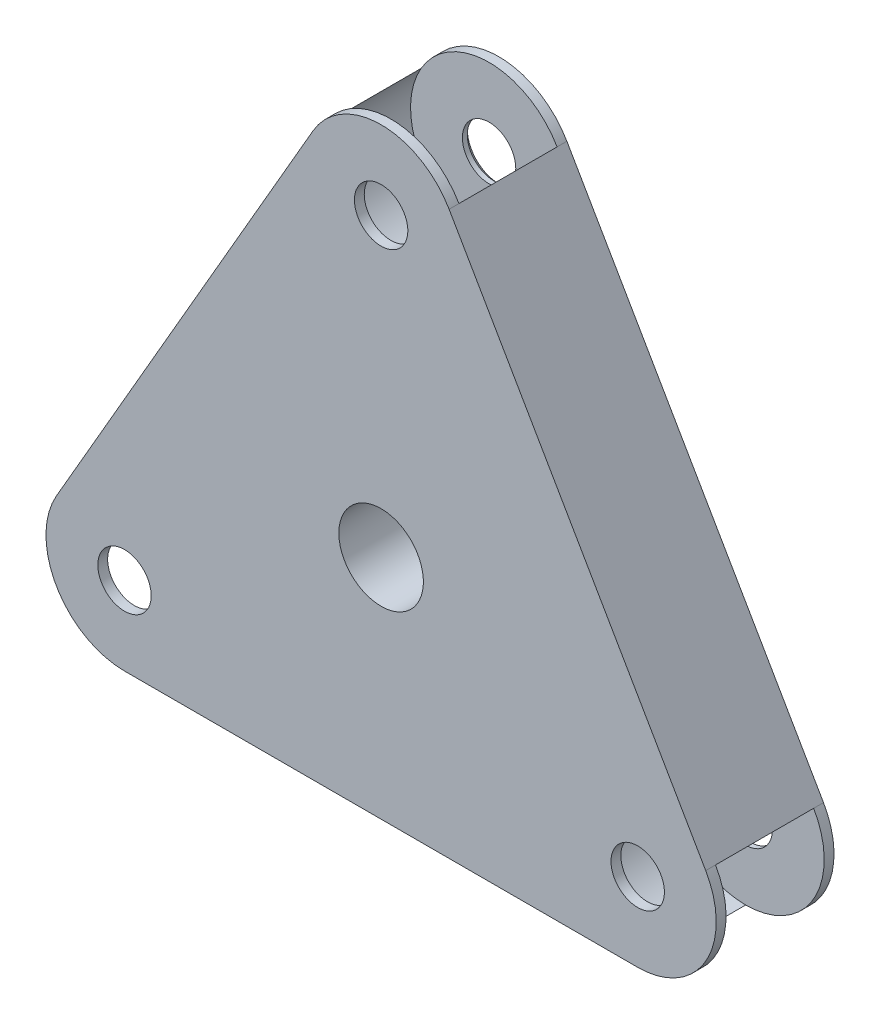
ISO-10303-21;
HEADER;
FILE_DESCRIPTION(('STEP AP214'),'2;1');
FILE_NAME('part.step','',(''),(''),'','','');
FILE_SCHEMA(('AUTOMOTIVE_DESIGN { 1 0 10303 214 1 1 1 1 }'));
ENDSEC;
DATA;
#1=APPLICATION_CONTEXT('core data for automotive mechanical design processes');
#2=APPLICATION_PROTOCOL_DEFINITION('international standard','automotive_design',2000,#1);
#3=PRODUCT_CONTEXT('',#1,'mechanical');
#4=PRODUCT('Part','Part','',(#3));
#5=PRODUCT_RELATED_PRODUCT_CATEGORY('part','',(#4));
#6=PRODUCT_DEFINITION_FORMATION('','',#4);
#7=PRODUCT_DEFINITION_CONTEXT('part definition',#1,'design');
#8=PRODUCT_DEFINITION('design','',#6,#7);
#9=PRODUCT_DEFINITION_SHAPE('','',#8);
#10=(LENGTH_UNIT() NAMED_UNIT(*) SI_UNIT(.MILLI.,.METRE.));
#11=(NAMED_UNIT(*) PLANE_ANGLE_UNIT() SI_UNIT($,.RADIAN.));
#12=(NAMED_UNIT(*) SI_UNIT($,.STERADIAN.) SOLID_ANGLE_UNIT());
#13=UNCERTAINTY_MEASURE_WITH_UNIT(LENGTH_MEASURE(1.E-05),#10,'distance_accuracy_value','');
#14=(GEOMETRIC_REPRESENTATION_CONTEXT(3) GLOBAL_UNCERTAINTY_ASSIGNED_CONTEXT((#13)) GLOBAL_UNIT_ASSIGNED_CONTEXT((#10,
#11,#12)) REPRESENTATION_CONTEXT('',''));
#15=CARTESIAN_POINT('',(0.,0.,0.));
#16=DIRECTION('',(0.,0.,1.));
#17=DIRECTION('',(1.,0.,0.));
#18=AXIS2_PLACEMENT_3D('',#15,#16,#17);
#19=CARTESIAN_POINT('',(32.6794919243113,-18.8675134594813,15.));
#20=DIRECTION('',(0.,0.,-1.));
#21=DIRECTION('',(-1.,0.,0.));
#22=AXIS2_PLACEMENT_3D('',#19,#20,#21);
#23=CYLINDRICAL_SURFACE('',#22,10.);
#24=CARTESIAN_POINT('',(32.6794919243112,-18.8675134594815,1.25));
#25=DIRECTION('',(0.,0.,1.));
#26=DIRECTION('',(-0.500000000000004,-0.866025403784436,0.));
#27=AXIS2_PLACEMENT_3D('',#24,#25,#26);
#28=CIRCLE('',#27,10.);
#29=CARTESIAN_POINT('',(32.6794919243112,-28.8675134594813,1.25));
#30=VERTEX_POINT('',#29);
#31=CARTESIAN_POINT('',(41.3397459621557,-13.8675134594814,1.25));
#32=VERTEX_POINT('',#31);
#33=EDGE_CURVE('E175',#30,#32,#28,.T.);
#34=ORIENTED_EDGE('',*,*,#33,.F.);
#35=DIRECTION('',(0.,0.,-1.));
#36=VECTOR('',#35,1.);
#37=CARTESIAN_POINT('',(32.6794919243113,-28.8675134594813,15.));
#38=LINE('',#37,#36);
#39=CARTESIAN_POINT('',(32.6794919243113,-28.8675134594813,0.));
#40=VERTEX_POINT('',#39);
#41=EDGE_CURVE('E306',#30,#40,#38,.T.);
#42=ORIENTED_EDGE('',*,*,#41,.T.);
#43=CARTESIAN_POINT('',(32.6794919243113,-18.8675134594813,0.));
#44=DIRECTION('',(0.,0.,1.));
#45=DIRECTION('',(1.,0.,0.));
#46=AXIS2_PLACEMENT_3D('',#43,#44,#45);
#47=CIRCLE('',#46,10.);
#48=CARTESIAN_POINT('',(41.3397459621556,-13.8675134594813,0.));
#49=VERTEX_POINT('',#48);
#50=EDGE_CURVE('E286',#40,#49,#47,.T.);
#51=ORIENTED_EDGE('',*,*,#50,.T.);
#52=DIRECTION('',(0.,0.,-1.));
#53=VECTOR('',#52,1.);
#54=CARTESIAN_POINT('',(41.3397459621556,-13.8675134594813,15.));
#55=LINE('',#54,#53);
#56=EDGE_CURVE('E198',#32,#49,#55,.T.);
#57=ORIENTED_EDGE('',*,*,#56,.F.);
#58=EDGE_LOOP('',(#34,#42,#51,#57));
#59=FACE_BOUND('',#58,.T.);
#60=ADVANCED_FACE('F53',(#59),#23,.T.);
#61=CARTESIAN_POINT('',(-32.6794919243113,-18.8675134594813,15.));
#62=DIRECTION('',(0.,0.,-1.));
#63=DIRECTION('',(-1.,0.,0.));
#64=AXIS2_PLACEMENT_3D('',#61,#62,#63);
#65=CYLINDRICAL_SURFACE('',#64,10.);
#66=CARTESIAN_POINT('',(-32.6794919243114,-18.867513459481,1.25));
#67=DIRECTION('',(0.,0.,1.));
#68=DIRECTION('',(-0.499999999999992,0.866025403784443,0.));
#69=AXIS2_PLACEMENT_3D('',#66,#67,#68);
#70=CIRCLE('',#69,10.);
#71=CARTESIAN_POINT('',(-41.3397459621559,-13.8675134594812,1.25));
#72=VERTEX_POINT('',#71);
#73=CARTESIAN_POINT('',(-32.6794919243113,-28.8675134594813,1.25));
#74=VERTEX_POINT('',#73);
#75=EDGE_CURVE('E68',#72,#74,#70,.T.);
#76=ORIENTED_EDGE('',*,*,#75,.F.);
#77=DIRECTION('',(0.,0.,-1.));
#78=VECTOR('',#77,1.);
#79=CARTESIAN_POINT('',(-41.3397459621556,-13.8675134594813,15.));
#80=LINE('',#79,#78);
#81=CARTESIAN_POINT('',(-41.3397459621556,-13.8675134594813,0.));
#82=VERTEX_POINT('',#81);
#83=EDGE_CURVE('E172',#72,#82,#80,.T.);
#84=ORIENTED_EDGE('',*,*,#83,.T.);
#85=CARTESIAN_POINT('',(-32.6794919243113,-18.8675134594813,0.));
#86=DIRECTION('',(0.,0.,1.));
#87=DIRECTION('',(1.,0.,0.));
#88=AXIS2_PLACEMENT_3D('',#85,#86,#87);
#89=CIRCLE('',#88,10.);
#90=CARTESIAN_POINT('',(-32.6794919243113,-28.8675134594813,0.));
#91=VERTEX_POINT('',#90);
#92=EDGE_CURVE('E321',#82,#91,#89,.T.);
#93=ORIENTED_EDGE('',*,*,#92,.T.);
#94=DIRECTION('',(0.,0.,-1.));
#95=VECTOR('',#94,1.);
#96=CARTESIAN_POINT('',(-32.6794919243113,-28.8675134594813,15.));
#97=LINE('',#96,#95);
#98=EDGE_CURVE('E330',#74,#91,#97,.T.);
#99=ORIENTED_EDGE('',*,*,#98,.F.);
#100=EDGE_LOOP('',(#76,#84,#93,#99));
#101=FACE_BOUND('',#100,.T.);
#102=ADVANCED_FACE('F384',(#101),#65,.T.);
#103=CARTESIAN_POINT('',(0.,37.7350269189626,15.));
#104=DIRECTION('',(0.,0.,-1.));
#105=DIRECTION('',(-1.,0.,0.));
#106=AXIS2_PLACEMENT_3D('',#103,#104,#105);
#107=CYLINDRICAL_SURFACE('',#106,10.);
#108=CARTESIAN_POINT('',(0.,37.7350269189626,1.25));
#109=DIRECTION('',(0.,0.,1.));
#110=DIRECTION('',(1.,0.,0.));
#111=AXIS2_PLACEMENT_3D('',#108,#109,#110);
#112=CIRCLE('',#111,10.);
#113=CARTESIAN_POINT('',(8.66025403784439,42.7350269189626,1.25));
#114=VERTEX_POINT('',#113);
#115=CARTESIAN_POINT('',(-8.66025403784439,42.7350269189626,1.25));
#116=VERTEX_POINT('',#115);
#117=EDGE_CURVE('E274',#114,#116,#112,.T.);
#118=ORIENTED_EDGE('',*,*,#117,.F.);
#119=DIRECTION('',(0.,0.,-1.));
#120=VECTOR('',#119,1.);
#121=CARTESIAN_POINT('',(8.66025403784438,42.7350269189626,15.));
#122=LINE('',#121,#120);
#123=CARTESIAN_POINT('',(8.66025403784438,42.7350269189626,0.));
#124=VERTEX_POINT('',#123);
#125=EDGE_CURVE('E193',#114,#124,#122,.T.);
#126=ORIENTED_EDGE('',*,*,#125,.T.);
#127=CARTESIAN_POINT('',(0.,37.7350269189626,0.));
#128=DIRECTION('',(0.,0.,1.));
#129=DIRECTION('',(-1.,0.,0.));
#130=AXIS2_PLACEMENT_3D('',#127,#128,#129);
#131=CIRCLE('',#130,10.);
#132=CARTESIAN_POINT('',(-8.66025403784439,42.7350269189626,0.));
#133=VERTEX_POINT('',#132);
#134=EDGE_CURVE('E314',#124,#133,#131,.T.);
#135=ORIENTED_EDGE('',*,*,#134,.T.);
#136=DIRECTION('',(0.,0.,-1.));
#137=VECTOR('',#136,1.);
#138=CARTESIAN_POINT('',(-8.66025403784439,42.7350269189626,15.));
#139=LINE('',#138,#137);
#140=EDGE_CURVE('E180',#116,#133,#139,.T.);
#141=ORIENTED_EDGE('',*,*,#140,.F.);
#142=EDGE_LOOP('',(#118,#126,#135,#141));
#143=FACE_BOUND('',#142,.T.);
#144=ADVANCED_FACE('F382',(#143),#107,.T.);
#145=CARTESIAN_POINT('',(32.6794919243113,-28.8675134594813,15.));
#146=VERTEX_POINT('',#145);
#147=CARTESIAN_POINT('',(32.6794919243113,-28.8675134594813,13.75));
#148=VERTEX_POINT('',#147);
#149=EDGE_CURVE('E327',#146,#148,#38,.T.);
#150=ORIENTED_EDGE('',*,*,#149,.T.);
#151=CARTESIAN_POINT('',(32.6794919243112,-18.8675134594815,13.75));
#152=DIRECTION('',(0.,0.,1.));
#153=DIRECTION('',(-0.500000000000004,-0.866025403784436,0.));
#154=AXIS2_PLACEMENT_3D('',#151,#152,#153);
#155=CIRCLE('',#154,10.);
#156=CARTESIAN_POINT('',(41.3397459621557,-13.8675134594814,13.75));
#157=VERTEX_POINT('',#156);
#158=EDGE_CURVE('E75',#148,#157,#155,.T.);
#159=ORIENTED_EDGE('',*,*,#158,.T.);
#160=CARTESIAN_POINT('',(41.3397459621556,-13.8675134594813,15.));
#161=VERTEX_POINT('',#160);
#162=EDGE_CURVE('E62',#161,#157,#55,.T.);
#163=ORIENTED_EDGE('',*,*,#162,.F.);
#164=CARTESIAN_POINT('',(32.6794919243113,-18.8675134594813,15.));
#165=DIRECTION('',(0.,0.,1.));
#166=DIRECTION('',(1.,0.,0.));
#167=AXIS2_PLACEMENT_3D('',#164,#165,#166);
#168=CIRCLE('',#167,10.);
#169=EDGE_CURVE('E287',#146,#161,#168,.T.);
#170=ORIENTED_EDGE('',*,*,#169,.F.);
#171=EDGE_LOOP('',(#150,#159,#163,#170));
#172=FACE_BOUND('',#171,.T.);
#173=ADVANCED_FACE('F55',(#172),#23,.T.);
#174=CARTESIAN_POINT('',(41.3397459621556,-13.8675134594813,15.));
#175=DIRECTION('',(-0.866025403784438,-0.5,0.));
#176=DIRECTION('',(0.5,-0.866025403784439,0.));
#177=AXIS2_PLACEMENT_3D('',#174,#175,#176);
#178=PLANE('',#177);
#179=DIRECTION('',(-0.5,0.866025403784438,0.));
#180=VECTOR('',#179,1.);
#181=CARTESIAN_POINT('',(41.3397459621556,-13.8675134594813,0.));
#182=LINE('',#181,#180);
#183=EDGE_CURVE('E310',#49,#124,#182,.T.);
#184=ORIENTED_EDGE('',*,*,#183,.T.);
#185=ORIENTED_EDGE('',*,*,#125,.F.);
#186=DIRECTION('',(0.,0.,1.));
#187=VECTOR('',#186,1.);
#188=CARTESIAN_POINT('',(8.66025403784439,42.7350269189626,1.25));
#189=LINE('',#188,#187);
#190=CARTESIAN_POINT('',(8.66025403784439,42.7350269189626,13.75));
#191=VERTEX_POINT('',#190);
#192=EDGE_CURVE('E277',#114,#191,#189,.T.);
#193=ORIENTED_EDGE('',*,*,#192,.T.);
#194=CARTESIAN_POINT('',(8.66025403784438,42.7350269189626,15.));
#195=VERTEX_POINT('',#194);
#196=EDGE_CURVE('E194',#195,#191,#122,.T.);
#197=ORIENTED_EDGE('',*,*,#196,.F.);
#198=DIRECTION('',(-0.5,0.866025403784438,0.));
#199=VECTOR('',#198,1.);
#200=CARTESIAN_POINT('',(41.3397459621556,-13.8675134594813,15.));
#201=LINE('',#200,#199);
#202=EDGE_CURVE('E291',#161,#195,#201,.T.);
#203=ORIENTED_EDGE('',*,*,#202,.F.);
#204=ORIENTED_EDGE('',*,*,#162,.T.);
#205=DIRECTION('',(0.,0.,1.));
#206=VECTOR('',#205,1.);
#207=CARTESIAN_POINT('',(41.3397459621556,-13.8675134594814,1.25));
#208=LINE('',#207,#206);
#209=EDGE_CURVE('E174',#32,#157,#208,.T.);
#210=ORIENTED_EDGE('',*,*,#209,.F.);
#211=ORIENTED_EDGE('',*,*,#56,.T.);
#212=EDGE_LOOP('',(#184,#185,#193,#197,#203,#204,#210,#211));
#213=FACE_BOUND('',#212,.T.);
#214=ADVANCED_FACE('F356',(#213),#178,.F.);
#215=ORIENTED_EDGE('',*,*,#196,.T.);
#216=CARTESIAN_POINT('',(0.,37.7350269189626,13.75));
#217=DIRECTION('',(0.,0.,1.));
#218=DIRECTION('',(1.,0.,0.));
#219=AXIS2_PLACEMENT_3D('',#216,#217,#218);
#220=CIRCLE('',#219,10.);
#221=CARTESIAN_POINT('',(-8.66025403784439,42.7350269189626,13.75));
#222=VERTEX_POINT('',#221);
#223=EDGE_CURVE('E279',#191,#222,#220,.T.);
#224=ORIENTED_EDGE('',*,*,#223,.T.);
#225=CARTESIAN_POINT('',(-8.66025403784439,42.7350269189626,15.));
#226=VERTEX_POINT('',#225);
#227=EDGE_CURVE('E186',#226,#222,#139,.T.);
#228=ORIENTED_EDGE('',*,*,#227,.F.);
#229=CARTESIAN_POINT('',(0.,37.7350269189626,15.));
#230=DIRECTION('',(0.,0.,1.));
#231=DIRECTION('',(-1.,0.,0.));
#232=AXIS2_PLACEMENT_3D('',#229,#230,#231);
#233=CIRCLE('',#232,10.);
#234=EDGE_CURVE('E295',#195,#226,#233,.T.);
#235=ORIENTED_EDGE('',*,*,#234,.F.);
#236=EDGE_LOOP('',(#215,#224,#228,#235));
#237=FACE_BOUND('',#236,.T.);
#238=ADVANCED_FACE('F374',(#237),#107,.T.);
#239=CARTESIAN_POINT('',(-8.66025403784439,42.7350269189626,15.));
#240=DIRECTION('',(0.866025403784438,-0.5,0.));
#241=DIRECTION('',(0.5,0.866025403784439,0.));
#242=AXIS2_PLACEMENT_3D('',#239,#240,#241);
#243=PLANE('',#242);
#244=DIRECTION('',(-0.5,-0.866025403784439,0.));
#245=VECTOR('',#244,1.);
#246=CARTESIAN_POINT('',(-8.66025403784439,42.7350269189626,0.));
#247=LINE('',#246,#245);
#248=EDGE_CURVE('E318',#133,#82,#247,.T.);
#249=ORIENTED_EDGE('',*,*,#248,.T.);
#250=ORIENTED_EDGE('',*,*,#83,.F.);
#251=DIRECTION('',(0.,0.,1.));
#252=VECTOR('',#251,1.);
#253=CARTESIAN_POINT('',(-41.3397459621557,-13.8675134594811,1.25));
#254=LINE('',#253,#252);
#255=CARTESIAN_POINT('',(-41.3397459621559,-13.8675134594812,13.75));
#256=VERTEX_POINT('',#255);
#257=EDGE_CURVE('E148',#72,#256,#254,.T.);
#258=ORIENTED_EDGE('',*,*,#257,.T.);
#259=CARTESIAN_POINT('',(-41.3397459621556,-13.8675134594813,15.));
#260=VERTEX_POINT('',#259);
#261=EDGE_CURVE('E170',#260,#256,#80,.T.);
#262=ORIENTED_EDGE('',*,*,#261,.F.);
#263=DIRECTION('',(-0.5,-0.866025403784439,0.));
#264=VECTOR('',#263,1.);
#265=CARTESIAN_POINT('',(-8.66025403784439,42.7350269189626,15.));
#266=LINE('',#265,#264);
#267=EDGE_CURVE('E298',#226,#260,#266,.T.);
#268=ORIENTED_EDGE('',*,*,#267,.F.);
#269=ORIENTED_EDGE('',*,*,#227,.T.);
#270=EDGE_CURVE('E184',#222,#116,#139,.T.);
#271=ORIENTED_EDGE('',*,*,#270,.T.);
#272=ORIENTED_EDGE('',*,*,#140,.T.);
#273=EDGE_LOOP('',(#249,#250,#258,#262,#268,#269,#271,#272));
#274=FACE_BOUND('',#273,.T.);
#275=ADVANCED_FACE('F168',(#274),#243,.F.);
#276=ORIENTED_EDGE('',*,*,#261,.T.);
#277=CARTESIAN_POINT('',(-32.6794919243114,-18.867513459481,13.75));
#278=DIRECTION('',(0.,0.,1.));
#279=DIRECTION('',(-0.499999999999992,0.866025403784443,0.));
#280=AXIS2_PLACEMENT_3D('',#277,#278,#279);
#281=CIRCLE('',#280,10.);
#282=CARTESIAN_POINT('',(-32.6794919243114,-28.8675134594813,13.75));
#283=VERTEX_POINT('',#282);
#284=EDGE_CURVE('E154',#256,#283,#281,.T.);
#285=ORIENTED_EDGE('',*,*,#284,.T.);
#286=CARTESIAN_POINT('',(-32.6794919243113,-28.8675134594813,15.));
#287=VERTEX_POINT('',#286);
#288=EDGE_CURVE('E187',#287,#283,#97,.T.);
#289=ORIENTED_EDGE('',*,*,#288,.F.);
#290=CARTESIAN_POINT('',(-32.6794919243113,-18.8675134594813,15.));
#291=DIRECTION('',(0.,0.,1.));
#292=DIRECTION('',(1.,0.,0.));
#293=AXIS2_PLACEMENT_3D('',#290,#291,#292);
#294=CIRCLE('',#293,10.);
#295=EDGE_CURVE('E178',#260,#287,#294,.T.);
#296=ORIENTED_EDGE('',*,*,#295,.F.);
#297=EDGE_LOOP('',(#276,#285,#289,#296));
#298=FACE_BOUND('',#297,.T.);
#299=ADVANCED_FACE('F177',(#298),#65,.T.);
#300=CARTESIAN_POINT('',(-32.6794919243113,-28.8675134594813,15.));
#301=DIRECTION('',(0.,1.,0.));
#302=DIRECTION('',(-1.,0.,0.));
#303=AXIS2_PLACEMENT_3D('',#300,#301,#302);
#304=PLANE('',#303);
#305=DIRECTION('',(1.,0.,0.));
#306=VECTOR('',#305,1.);
#307=CARTESIAN_POINT('',(-32.6794919243113,-28.8675134594813,0.));
#308=LINE('',#307,#306);
#309=EDGE_CURVE('E292',#91,#40,#308,.T.);
#310=ORIENTED_EDGE('',*,*,#309,.T.);
#311=ORIENTED_EDGE('',*,*,#41,.F.);
#312=EDGE_CURVE('E331',#148,#30,#38,.T.);
#313=ORIENTED_EDGE('',*,*,#312,.F.);
#314=ORIENTED_EDGE('',*,*,#149,.F.);
#315=DIRECTION('',(1.,0.,0.));
#316=VECTOR('',#315,1.);
#317=CARTESIAN_POINT('',(-32.6794919243113,-28.8675134594813,15.));
#318=LINE('',#317,#316);
#319=EDGE_CURVE('E303',#287,#146,#318,.T.);
#320=ORIENTED_EDGE('',*,*,#319,.F.);
#321=ORIENTED_EDGE('',*,*,#288,.T.);
#322=EDGE_CURVE('E150',#283,#74,#97,.T.);
#323=ORIENTED_EDGE('',*,*,#322,.T.);
#324=ORIENTED_EDGE('',*,*,#98,.T.);
#325=EDGE_LOOP('',(#310,#311,#313,#314,#320,#321,#323,#324));
#326=FACE_BOUND('',#325,.T.);
#327=ADVANCED_FACE('F346',(#326),#304,.F.);
#328=CARTESIAN_POINT('',(32.6794919243113,-18.8675134594813,15.));
#329=DIRECTION('',(0.,0.,1.));
#330=DIRECTION('',(1.,0.,0.));
#331=AXIS2_PLACEMENT_3D('',#328,#329,#330);
#332=PLANE('',#331);
#333=CARTESIAN_POINT('',(0.,0.,15.));
#334=DIRECTION('',(0.,0.,-1.));
#335=DIRECTION('',(-1.,0.,0.));
#336=AXIS2_PLACEMENT_3D('',#333,#334,#335);
#337=CIRCLE('',#336,5.38324720789193);
#338=CARTESIAN_POINT('',(-5.38324720789193,0.,15.));
#339=VERTEX_POINT('',#338);
#340=EDGE_CURVE('E694',#339,#339,#337,.T.);
#341=ORIENTED_EDGE('',*,*,#340,.T.);
#342=EDGE_LOOP('',(#341));
#343=FACE_BOUND('',#342,.T.);
#344=CARTESIAN_POINT('',(0.,37.7350269189626,15.));
#345=DIRECTION('',(0.,0.,-1.));
#346=DIRECTION('',(-1.,0.,0.));
#347=AXIS2_PLACEMENT_3D('',#344,#345,#346);
#348=CIRCLE('',#347,3.4);
#349=CARTESIAN_POINT('',(-3.4,37.7350269189626,15.));
#350=VERTEX_POINT('',#349);
#351=EDGE_CURVE('E210',#350,#350,#348,.T.);
#352=ORIENTED_EDGE('',*,*,#351,.T.);
#353=EDGE_LOOP('',(#352));
#354=FACE_BOUND('',#353,.T.);
#355=CARTESIAN_POINT('',(-32.6794919243113,-18.8675134594813,15.));
#356=DIRECTION('',(0.,0.,-1.));
#357=DIRECTION('',(-1.,0.,0.));
#358=AXIS2_PLACEMENT_3D('',#355,#356,#357);
#359=CIRCLE('',#358,3.4);
#360=CARTESIAN_POINT('',(-36.0794919243113,-18.8675134594813,15.));
#361=VERTEX_POINT('',#360);
#362=EDGE_CURVE('E236',#361,#361,#359,.T.);
#363=ORIENTED_EDGE('',*,*,#362,.T.);
#364=EDGE_LOOP('',(#363));
#365=FACE_BOUND('',#364,.T.);
#366=CARTESIAN_POINT('',(32.6794919243113,-18.8675134594813,15.));
#367=DIRECTION('',(0.,0.,-1.));
#368=DIRECTION('',(-1.,0.,0.));
#369=AXIS2_PLACEMENT_3D('',#366,#367,#368);
#370=CIRCLE('',#369,3.4);
#371=CARTESIAN_POINT('',(29.2794919243113,-18.8675134594813,15.));
#372=VERTEX_POINT('',#371);
#373=EDGE_CURVE('E205',#372,#372,#370,.T.);
#374=ORIENTED_EDGE('',*,*,#373,.T.);
#375=EDGE_LOOP('',(#374));
#376=FACE_BOUND('',#375,.T.);
#377=ORIENTED_EDGE('',*,*,#169,.T.);
#378=ORIENTED_EDGE('',*,*,#202,.T.);
#379=ORIENTED_EDGE('',*,*,#234,.T.);
#380=ORIENTED_EDGE('',*,*,#267,.T.);
#381=ORIENTED_EDGE('',*,*,#295,.T.);
#382=ORIENTED_EDGE('',*,*,#319,.T.);
#383=EDGE_LOOP('',(#377,#378,#379,#380,#381,#382));
#384=FACE_BOUND('',#383,.T.);
#385=ADVANCED_FACE('F389',(#343,#354,#365,#376,#384),#332,.T.);
#386=CARTESIAN_POINT('',(32.6794919243113,-18.8675134594813,0.));
#387=DIRECTION('',(0.,0.,1.));
#388=DIRECTION('',(1.,0.,0.));
#389=AXIS2_PLACEMENT_3D('',#386,#387,#388);
#390=PLANE('',#389);
#391=CARTESIAN_POINT('',(0.,0.,0.));
#392=DIRECTION('',(0.,0.,1.));
#393=DIRECTION('',(1.,0.,0.));
#394=AXIS2_PLACEMENT_3D('',#391,#392,#393);
#395=CIRCLE('',#394,7.460158595595);
#396=CARTESIAN_POINT('',(7.460158595595,0.,0.));
#397=VERTEX_POINT('',#396);
#398=EDGE_CURVE('E11',#397,#397,#395,.F.);
#399=ORIENTED_EDGE('',*,*,#398,.F.);
#400=EDGE_LOOP('',(#399));
#401=FACE_BOUND('',#400,.T.);
#402=CARTESIAN_POINT('',(0.,37.7350269189626,0.));
#403=DIRECTION('',(0.,0.,-1.));
#404=DIRECTION('',(-1.,0.,0.));
#405=AXIS2_PLACEMENT_3D('',#402,#403,#404);
#406=CIRCLE('',#405,4.025);
#407=CARTESIAN_POINT('',(-4.025,37.7350269189626,0.));
#408=VERTEX_POINT('',#407);
#409=EDGE_CURVE('E225',#408,#408,#406,.T.);
#410=ORIENTED_EDGE('',*,*,#409,.F.);
#411=EDGE_LOOP('',(#410));
#412=FACE_BOUND('',#411,.T.);
#413=CARTESIAN_POINT('',(-32.6794919243113,-18.8675134594813,0.));
#414=DIRECTION('',(0.,0.,-1.));
#415=DIRECTION('',(-1.,0.,0.));
#416=AXIS2_PLACEMENT_3D('',#413,#414,#415);
#417=CIRCLE('',#416,4.025);
#418=CARTESIAN_POINT('',(-36.7044919243113,-18.8675134594813,0.));
#419=VERTEX_POINT('',#418);
#420=EDGE_CURVE('E216',#419,#419,#417,.T.);
#421=ORIENTED_EDGE('',*,*,#420,.F.);
#422=EDGE_LOOP('',(#421));
#423=FACE_BOUND('',#422,.T.);
#424=CARTESIAN_POINT('',(32.6794919243113,-18.8675134594813,0.));
#425=DIRECTION('',(0.,0.,-1.));
#426=DIRECTION('',(-1.,0.,0.));
#427=AXIS2_PLACEMENT_3D('',#424,#425,#426);
#428=CIRCLE('',#427,4.025);
#429=CARTESIAN_POINT('',(28.6544919243113,-18.8675134594813,0.));
#430=VERTEX_POINT('',#429);
#431=EDGE_CURVE('E248',#430,#430,#428,.T.);
#432=ORIENTED_EDGE('',*,*,#431,.F.);
#433=EDGE_LOOP('',(#432));
#434=FACE_BOUND('',#433,.T.);
#435=ORIENTED_EDGE('',*,*,#50,.F.);
#436=ORIENTED_EDGE('',*,*,#309,.F.);
#437=ORIENTED_EDGE('',*,*,#92,.F.);
#438=ORIENTED_EDGE('',*,*,#248,.F.);
#439=ORIENTED_EDGE('',*,*,#134,.F.);
#440=ORIENTED_EDGE('',*,*,#183,.F.);
#441=EDGE_LOOP('',(#435,#436,#437,#438,#439,#440));
#442=FACE_BOUND('',#441,.T.);
#443=ADVANCED_FACE('F351',(#401,#412,#423,#434,#442),#390,.F.);
#444=CARTESIAN_POINT('',(0.,37.7350269189626,1.25));
#445=DIRECTION('',(0.,0.,1.));
#446=DIRECTION('',(1.,0.,0.));
#447=AXIS2_PLACEMENT_3D('',#444,#445,#446);
#448=CYLINDRICAL_SURFACE('',#447,10.);
#449=EDGE_CURVE('E278',#116,#114,#112,.T.);
#450=ORIENTED_EDGE('',*,*,#449,.F.);
#451=ORIENTED_EDGE('',*,*,#270,.F.);
#452=EDGE_CURVE('E273',#222,#191,#220,.T.);
#453=ORIENTED_EDGE('',*,*,#452,.T.);
#454=ORIENTED_EDGE('',*,*,#192,.F.);
#455=EDGE_LOOP('',(#450,#451,#453,#454));
#456=FACE_BOUND('',#455,.T.);
#457=ADVANCED_FACE('F367',(#456),#448,.F.);
#458=CARTESIAN_POINT('',(0.,37.7350269189626,1.25));
#459=DIRECTION('',(0.,0.,1.));
#460=DIRECTION('',(1.,0.,0.));
#461=AXIS2_PLACEMENT_3D('',#458,#459,#460);
#462=PLANE('',#461);
#463=CARTESIAN_POINT('',(0.,37.7350269189626,1.25));
#464=DIRECTION('',(0.,0.,1.));
#465=DIRECTION('',(1.,0.,0.));
#466=AXIS2_PLACEMENT_3D('',#463,#464,#465);
#467=CIRCLE('',#466,3.39999999999999);
#468=CARTESIAN_POINT('',(3.39999999999999,37.7350269189626,1.25));
#469=VERTEX_POINT('',#468);
#470=EDGE_CURVE('E206',#469,#469,#467,.T.);
#471=ORIENTED_EDGE('',*,*,#470,.F.);
#472=EDGE_LOOP('',(#471));
#473=FACE_BOUND('',#472,.T.);
#474=ORIENTED_EDGE('',*,*,#117,.T.);
#475=ORIENTED_EDGE('',*,*,#449,.T.);
#476=EDGE_LOOP('',(#474,#475));
#477=FACE_BOUND('',#476,.T.);
#478=ADVANCED_FACE('F379',(#473,#477),#462,.T.);
#479=CARTESIAN_POINT('',(0.,37.7350269189626,13.75));
#480=DIRECTION('',(0.,0.,1.));
#481=DIRECTION('',(1.,0.,0.));
#482=AXIS2_PLACEMENT_3D('',#479,#480,#481);
#483=PLANE('',#482);
#484=CARTESIAN_POINT('',(0.,37.7350269189626,13.75));
#485=DIRECTION('',(0.,0.,1.));
#486=DIRECTION('',(1.,0.,0.));
#487=AXIS2_PLACEMENT_3D('',#484,#485,#486);
#488=CIRCLE('',#487,3.39999999999999);
#489=CARTESIAN_POINT('',(3.39999999999999,37.7350269189626,13.75));
#490=VERTEX_POINT('',#489);
#491=EDGE_CURVE('E209',#490,#490,#488,.T.);
#492=ORIENTED_EDGE('',*,*,#491,.T.);
#493=EDGE_LOOP('',(#492));
#494=FACE_BOUND('',#493,.T.);
#495=ORIENTED_EDGE('',*,*,#223,.F.);
#496=ORIENTED_EDGE('',*,*,#452,.F.);
#497=EDGE_LOOP('',(#495,#496));
#498=FACE_BOUND('',#497,.T.);
#499=ADVANCED_FACE('F371',(#494,#498),#483,.F.);
#500=CARTESIAN_POINT('',(-32.6794919243114,-18.867513459481,1.25));
#501=DIRECTION('',(0.,0.,1.));
#502=DIRECTION('',(1.,0.,0.));
#503=AXIS2_PLACEMENT_3D('',#500,#501,#502);
#504=CYLINDRICAL_SURFACE('',#503,10.);
#505=EDGE_CURVE('E163',#74,#72,#70,.T.);
#506=ORIENTED_EDGE('',*,*,#505,.F.);
#507=ORIENTED_EDGE('',*,*,#322,.F.);
#508=EDGE_CURVE('E144',#283,#256,#281,.T.);
#509=ORIENTED_EDGE('',*,*,#508,.T.);
#510=ORIENTED_EDGE('',*,*,#257,.F.);
#511=EDGE_LOOP('',(#506,#507,#509,#510));
#512=FACE_BOUND('',#511,.T.);
#513=ADVANCED_FACE('F146',(#512),#504,.F.);
#514=CARTESIAN_POINT('',(-32.6794919243114,-18.867513459481,1.25));
#515=DIRECTION('',(0.,0.,1.));
#516=DIRECTION('',(-0.499999999999992,0.866025403784443,0.));
#517=AXIS2_PLACEMENT_3D('',#514,#515,#516);
#518=PLANE('',#517);
#519=CARTESIAN_POINT('',(-32.6794919243113,-18.8675134594813,1.25));
#520=DIRECTION('',(0.,0.,1.));
#521=DIRECTION('',(1.,0.,0.));
#522=AXIS2_PLACEMENT_3D('',#519,#520,#521);
#523=CIRCLE('',#522,3.39999999999999);
#524=CARTESIAN_POINT('',(-29.2794919243113,-18.8675134594813,1.25));
#525=VERTEX_POINT('',#524);
#526=EDGE_CURVE('E240',#525,#525,#523,.T.);
#527=ORIENTED_EDGE('',*,*,#526,.F.);
#528=EDGE_LOOP('',(#527));
#529=FACE_BOUND('',#528,.T.);
#530=ORIENTED_EDGE('',*,*,#75,.T.);
#531=ORIENTED_EDGE('',*,*,#505,.T.);
#532=EDGE_LOOP('',(#530,#531));
#533=FACE_BOUND('',#532,.T.);
#534=ADVANCED_FACE('F468',(#529,#533),#518,.T.);
#535=CARTESIAN_POINT('',(-32.6794919243114,-18.867513459481,13.75));
#536=DIRECTION('',(0.,0.,1.));
#537=DIRECTION('',(-0.499999999999992,0.866025403784443,0.));
#538=AXIS2_PLACEMENT_3D('',#535,#536,#537);
#539=PLANE('',#538);
#540=CARTESIAN_POINT('',(-32.6794919243113,-18.8675134594813,13.75));
#541=DIRECTION('',(0.,0.,1.));
#542=DIRECTION('',(1.,0.,0.));
#543=AXIS2_PLACEMENT_3D('',#540,#541,#542);
#544=CIRCLE('',#543,3.39999999999999);
#545=CARTESIAN_POINT('',(-29.2794919243113,-18.8675134594813,13.75));
#546=VERTEX_POINT('',#545);
#547=EDGE_CURVE('E244',#546,#546,#544,.T.);
#548=ORIENTED_EDGE('',*,*,#547,.T.);
#549=EDGE_LOOP('',(#548));
#550=FACE_BOUND('',#549,.T.);
#551=ORIENTED_EDGE('',*,*,#284,.F.);
#552=ORIENTED_EDGE('',*,*,#508,.F.);
#553=EDGE_LOOP('',(#551,#552));
#554=FACE_BOUND('',#553,.T.);
#555=ADVANCED_FACE('F157',(#550,#554),#539,.F.);
#556=CARTESIAN_POINT('',(32.6794919243112,-18.8675134594815,1.25));
#557=DIRECTION('',(0.,0.,1.));
#558=DIRECTION('',(1.,0.,0.));
#559=AXIS2_PLACEMENT_3D('',#556,#557,#558);
#560=CYLINDRICAL_SURFACE('',#559,10.);
#561=ORIENTED_EDGE('',*,*,#209,.T.);
#562=EDGE_CURVE('E268',#157,#148,#155,.T.);
#563=ORIENTED_EDGE('',*,*,#562,.T.);
#564=ORIENTED_EDGE('',*,*,#312,.T.);
#565=EDGE_CURVE('E265',#32,#30,#28,.T.);
#566=ORIENTED_EDGE('',*,*,#565,.F.);
#567=EDGE_LOOP('',(#561,#563,#564,#566));
#568=FACE_BOUND('',#567,.T.);
#569=ADVANCED_FACE('F485',(#568),#560,.F.);
#570=CARTESIAN_POINT('',(32.6794919243112,-18.8675134594815,1.25));
#571=DIRECTION('',(0.,0.,1.));
#572=DIRECTION('',(-0.500000000000004,-0.866025403784436,0.));
#573=AXIS2_PLACEMENT_3D('',#570,#571,#572);
#574=PLANE('',#573);
#575=CARTESIAN_POINT('',(32.6794919243113,-18.8675134594813,1.25));
#576=DIRECTION('',(0.,0.,1.));
#577=DIRECTION('',(1.,0.,0.));
#578=AXIS2_PLACEMENT_3D('',#575,#576,#577);
#579=CIRCLE('',#578,3.39999999999999);
#580=CARTESIAN_POINT('',(36.0794919243112,-18.8675134594813,1.25));
#581=VERTEX_POINT('',#580);
#582=EDGE_CURVE('E155',#581,#581,#579,.T.);
#583=ORIENTED_EDGE('',*,*,#582,.F.);
#584=EDGE_LOOP('',(#583));
#585=FACE_BOUND('',#584,.T.);
#586=ORIENTED_EDGE('',*,*,#33,.T.);
#587=ORIENTED_EDGE('',*,*,#565,.T.);
#588=EDGE_LOOP('',(#586,#587));
#589=FACE_BOUND('',#588,.T.);
#590=ADVANCED_FACE('F495',(#585,#589),#574,.T.);
#591=CARTESIAN_POINT('',(32.6794919243112,-18.8675134594815,13.75));
#592=DIRECTION('',(0.,0.,1.));
#593=DIRECTION('',(-0.500000000000004,-0.866025403784436,0.));
#594=AXIS2_PLACEMENT_3D('',#591,#592,#593);
#595=PLANE('',#594);
#596=CARTESIAN_POINT('',(32.6794919243113,-18.8675134594813,13.75));
#597=DIRECTION('',(0.,0.,1.));
#598=DIRECTION('',(1.,0.,0.));
#599=AXIS2_PLACEMENT_3D('',#596,#597,#598);
#600=CIRCLE('',#599,3.39999999999999);
#601=CARTESIAN_POINT('',(36.0794919243112,-18.8675134594813,13.75));
#602=VERTEX_POINT('',#601);
#603=EDGE_CURVE('E202',#602,#602,#600,.T.);
#604=ORIENTED_EDGE('',*,*,#603,.T.);
#605=EDGE_LOOP('',(#604));
#606=FACE_BOUND('',#605,.T.);
#607=ORIENTED_EDGE('',*,*,#158,.F.);
#608=ORIENTED_EDGE('',*,*,#562,.F.);
#609=EDGE_LOOP('',(#607,#608));
#610=FACE_BOUND('',#609,.T.);
#611=ADVANCED_FACE('F504',(#606,#610),#595,.F.);
#612=CARTESIAN_POINT('',(32.6794919243113,-18.8675134594813,0.));
#613=DIRECTION('',(0.,0.,-1.));
#614=DIRECTION('',(-1.,0.,0.));
#615=AXIS2_PLACEMENT_3D('',#612,#613,#614);
#616=CYLINDRICAL_SURFACE('',#615,3.39999999999999);
#617=ORIENTED_EDGE('',*,*,#373,.F.);
#618=EDGE_LOOP('',(#617));
#619=FACE_BOUND('',#618,.T.);
#620=ORIENTED_EDGE('',*,*,#603,.F.);
#621=EDGE_LOOP('',(#620));
#622=FACE_BOUND('',#621,.T.);
#623=ADVANCED_FACE('F514',(#619,#622),#616,.F.);
#624=ORIENTED_EDGE('',*,*,#582,.T.);
#625=EDGE_LOOP('',(#624));
#626=FACE_BOUND('',#625,.T.);
#627=CARTESIAN_POINT('',(32.6794919243113,-18.8675134594813,0.625000000000014));
#628=DIRECTION('',(0.,0.,-1.));
#629=DIRECTION('',(-1.,0.,0.));
#630=AXIS2_PLACEMENT_3D('',#627,#628,#629);
#631=CIRCLE('',#630,3.39999999999999);
#632=CARTESIAN_POINT('',(29.2794919243113,-18.8675134594813,0.625000000000014));
#633=VERTEX_POINT('',#632);
#634=EDGE_CURVE('E252',#633,#633,#631,.T.);
#635=ORIENTED_EDGE('',*,*,#634,.T.);
#636=EDGE_LOOP('',(#635));
#637=FACE_BOUND('',#636,.T.);
#638=ADVANCED_FACE('F525',(#626,#637),#616,.F.);
#639=CARTESIAN_POINT('',(32.6794919243113,-18.8675134594813,0.));
#640=DIRECTION('',(0.,0.,-1.));
#641=DIRECTION('',(-1.,0.,0.));
#642=AXIS2_PLACEMENT_3D('',#639,#640,#641);
#643=CONICAL_SURFACE('',#642,4.025,0.785398163397447);
#644=ORIENTED_EDGE('',*,*,#634,.F.);
#645=EDGE_LOOP('',(#644));
#646=FACE_BOUND('',#645,.T.);
#647=ORIENTED_EDGE('',*,*,#431,.T.);
#648=EDGE_LOOP('',(#647));
#649=FACE_BOUND('',#648,.T.);
#650=ADVANCED_FACE('F537',(#646,#649),#643,.F.);
#651=CARTESIAN_POINT('',(-32.6794919243113,-18.8675134594813,0.));
#652=DIRECTION('',(0.,0.,-1.));
#653=DIRECTION('',(-1.,0.,0.));
#654=AXIS2_PLACEMENT_3D('',#651,#652,#653);
#655=CYLINDRICAL_SURFACE('',#654,3.39999999999999);
#656=ORIENTED_EDGE('',*,*,#362,.F.);
#657=EDGE_LOOP('',(#656));
#658=FACE_BOUND('',#657,.T.);
#659=ORIENTED_EDGE('',*,*,#547,.F.);
#660=EDGE_LOOP('',(#659));
#661=FACE_BOUND('',#660,.T.);
#662=ADVANCED_FACE('F548',(#658,#661),#655,.F.);
#663=ORIENTED_EDGE('',*,*,#526,.T.);
#664=EDGE_LOOP('',(#663));
#665=FACE_BOUND('',#664,.T.);
#666=CARTESIAN_POINT('',(-32.6794919243113,-18.8675134594813,0.625000000000014));
#667=DIRECTION('',(0.,0.,-1.));
#668=DIRECTION('',(-1.,0.,0.));
#669=AXIS2_PLACEMENT_3D('',#666,#667,#668);
#670=CIRCLE('',#669,3.39999999999999);
#671=CARTESIAN_POINT('',(-36.0794919243112,-18.8675134594813,0.625000000000014));
#672=VERTEX_POINT('',#671);
#673=EDGE_CURVE('E232',#672,#672,#670,.T.);
#674=ORIENTED_EDGE('',*,*,#673,.T.);
#675=EDGE_LOOP('',(#674));
#676=FACE_BOUND('',#675,.T.);
#677=ADVANCED_FACE('F559',(#665,#676),#655,.F.);
#678=CARTESIAN_POINT('',(-32.6794919243113,-18.8675134594813,0.));
#679=DIRECTION('',(0.,0.,-1.));
#680=DIRECTION('',(-1.,0.,0.));
#681=AXIS2_PLACEMENT_3D('',#678,#679,#680);
#682=CONICAL_SURFACE('',#681,4.025,0.785398163397447);
#683=ORIENTED_EDGE('',*,*,#673,.F.);
#684=EDGE_LOOP('',(#683));
#685=FACE_BOUND('',#684,.T.);
#686=ORIENTED_EDGE('',*,*,#420,.T.);
#687=EDGE_LOOP('',(#686));
#688=FACE_BOUND('',#687,.T.);
#689=ADVANCED_FACE('F571',(#685,#688),#682,.F.);
#690=CARTESIAN_POINT('',(0.,37.7350269189626,0.));
#691=DIRECTION('',(0.,0.,-1.));
#692=DIRECTION('',(-1.,0.,0.));
#693=AXIS2_PLACEMENT_3D('',#690,#691,#692);
#694=CYLINDRICAL_SURFACE('',#693,3.39999999999999);
#695=ORIENTED_EDGE('',*,*,#470,.T.);
#696=EDGE_LOOP('',(#695));
#697=FACE_BOUND('',#696,.T.);
#698=CARTESIAN_POINT('',(0.,37.7350269189626,0.625000000000014));
#699=DIRECTION('',(0.,0.,-1.));
#700=DIRECTION('',(-1.,0.,0.));
#701=AXIS2_PLACEMENT_3D('',#698,#699,#700);
#702=CIRCLE('',#701,3.39999999999999);
#703=CARTESIAN_POINT('',(-3.39999999999999,37.7350269189626,0.625000000000014));
#704=VERTEX_POINT('',#703);
#705=EDGE_CURVE('E219',#704,#704,#702,.T.);
#706=ORIENTED_EDGE('',*,*,#705,.T.);
#707=EDGE_LOOP('',(#706));
#708=FACE_BOUND('',#707,.T.);
#709=ADVANCED_FACE('F582',(#697,#708),#694,.F.);
#710=CARTESIAN_POINT('',(0.,37.7350269189626,0.));
#711=DIRECTION('',(0.,0.,-1.));
#712=DIRECTION('',(-1.,0.,0.));
#713=AXIS2_PLACEMENT_3D('',#710,#711,#712);
#714=CONICAL_SURFACE('',#713,4.025,0.785398163397446);
#715=ORIENTED_EDGE('',*,*,#705,.F.);
#716=EDGE_LOOP('',(#715));
#717=FACE_BOUND('',#716,.T.);
#718=ORIENTED_EDGE('',*,*,#409,.T.);
#719=EDGE_LOOP('',(#718));
#720=FACE_BOUND('',#719,.T.);
#721=ADVANCED_FACE('F593',(#717,#720),#714,.F.);
#722=ORIENTED_EDGE('',*,*,#351,.F.);
#723=EDGE_LOOP('',(#722));
#724=FACE_BOUND('',#723,.T.);
#725=ORIENTED_EDGE('',*,*,#491,.F.);
#726=EDGE_LOOP('',(#725));
#727=FACE_BOUND('',#726,.T.);
#728=ADVANCED_FACE('F595',(#724,#727),#694,.F.);
#729=CARTESIAN_POINT('',(0.,0.,-12.5));
#730=DIRECTION('',(0.,0.,-1.));
#731=DIRECTION('',(-1.,0.,0.));
#732=AXIS2_PLACEMENT_3D('',#729,#730,#731);
#733=PLANE('',#732);
#734=CARTESIAN_POINT('',(0.,0.,-12.5));
#735=DIRECTION('',(0.,0.,-1.));
#736=DIRECTION('',(-1.,0.,0.));
#737=AXIS2_PLACEMENT_3D('',#734,#735,#736);
#738=CIRCLE('',#737,7.460158595595);
#739=CARTESIAN_POINT('',(-7.460158595595,0.,-12.5));
#740=VERTEX_POINT('',#739);
#741=EDGE_CURVE('E685',#740,#740,#738,.T.);
#742=ORIENTED_EDGE('',*,*,#741,.T.);
#743=EDGE_LOOP('',(#742));
#744=FACE_BOUND('',#743,.T.);
#745=CARTESIAN_POINT('',(0.,0.,-12.5));
#746=DIRECTION('',(0.,0.,-1.));
#747=DIRECTION('',(-1.,0.,0.));
#748=AXIS2_PLACEMENT_3D('',#745,#746,#747);
#749=CIRCLE('',#748,5.38324720789193);
#750=CARTESIAN_POINT('',(-5.38324720789193,0.,-12.5));
#751=VERTEX_POINT('',#750);
#752=EDGE_CURVE('E688',#751,#751,#749,.T.);
#753=ORIENTED_EDGE('',*,*,#752,.F.);
#754=EDGE_LOOP('',(#753));
#755=FACE_BOUND('',#754,.T.);
#756=ADVANCED_FACE('F615',(#744,#755),#733,.T.);
#757=CARTESIAN_POINT('',(0.,0.,-12.5));
#758=DIRECTION('',(0.,0.,1.));
#759=DIRECTION('',(1.,0.,0.));
#760=AXIS2_PLACEMENT_3D('',#757,#758,#759);
#761=CYLINDRICAL_SURFACE('',#760,7.460158595595);
#762=ORIENTED_EDGE('',*,*,#741,.F.);
#763=EDGE_LOOP('',(#762));
#764=FACE_BOUND('',#763,.T.);
#765=ORIENTED_EDGE('',*,*,#398,.T.);
#766=EDGE_LOOP('',(#765));
#767=FACE_BOUND('',#766,.T.);
#768=ADVANCED_FACE('F626',(#764,#767),#761,.T.);
#769=CARTESIAN_POINT('',(0.,0.,-12.5));
#770=DIRECTION('',(0.,0.,1.));
#771=DIRECTION('',(1.,0.,0.));
#772=AXIS2_PLACEMENT_3D('',#769,#770,#771);
#773=CYLINDRICAL_SURFACE('',#772,5.38324720789193);
#774=ORIENTED_EDGE('',*,*,#752,.T.);
#775=EDGE_LOOP('',(#774));
#776=FACE_BOUND('',#775,.T.);
#777=ORIENTED_EDGE('',*,*,#340,.F.);
#778=EDGE_LOOP('',(#777));
#779=FACE_BOUND('',#778,.T.);
#780=ADVANCED_FACE('F636',(#776,#779),#773,.F.);
#781=CLOSED_SHELL('',(#60,#102,#144,#173,#214,#238,#275,#299,#327,#385,#443,#457,#478,#499,#513,
#534,#555,#569,#590,#611,#623,#638,#650,#662,#677,#689,#709,#721,#728,#756,#768,#780));
#782=MANIFOLD_SOLID_BREP('B2',#781);
#783=ADVANCED_BREP_SHAPE_REPRESENTATION('',(#18,#782),#14);
#784=SHAPE_DEFINITION_REPRESENTATION(#9,#783);
ENDSEC;
END-ISO-10303-21;
